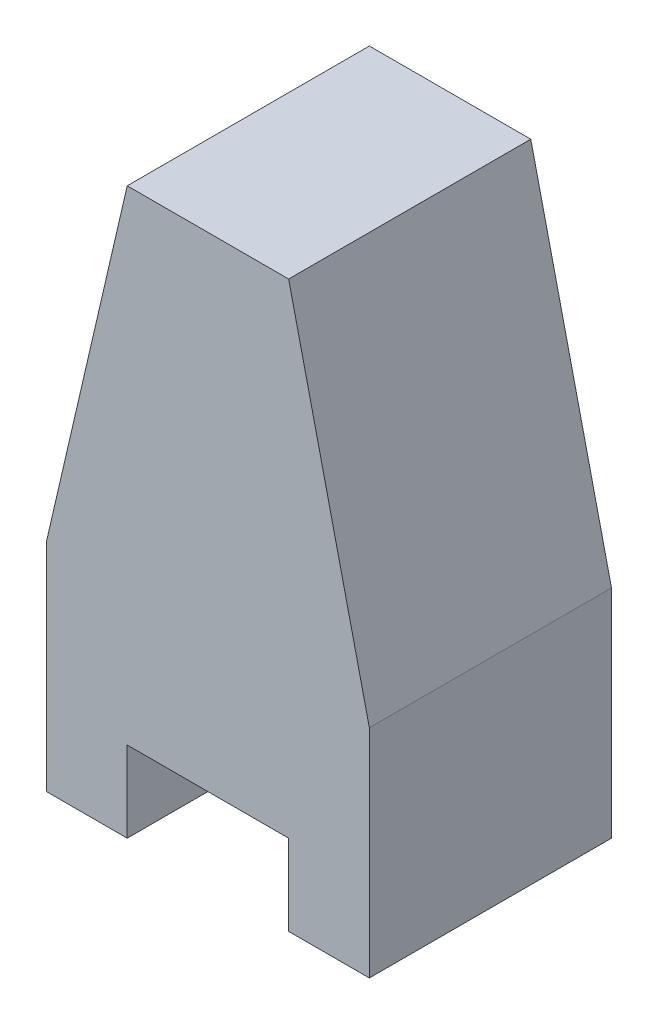
ISO-10303-21;
HEADER;
FILE_DESCRIPTION(('STEP AP214'),'2;1');
FILE_NAME('part.step','',(''),(''),'','','');
FILE_SCHEMA(('AUTOMOTIVE_DESIGN { 1 0 10303 214 1 1 1 1 }'));
ENDSEC;
DATA;
#1=APPLICATION_CONTEXT('core data for automotive mechanical design processes');
#2=APPLICATION_PROTOCOL_DEFINITION('international standard','automotive_design',2000,#1);
#3=PRODUCT_CONTEXT('',#1,'mechanical');
#4=PRODUCT('Part','Part','',(#3));
#5=PRODUCT_RELATED_PRODUCT_CATEGORY('part','',(#4));
#6=PRODUCT_DEFINITION_FORMATION('','',#4);
#7=PRODUCT_DEFINITION_CONTEXT('part definition',#1,'design');
#8=PRODUCT_DEFINITION('design','',#6,#7);
#9=PRODUCT_DEFINITION_SHAPE('','',#8);
#10=(LENGTH_UNIT() NAMED_UNIT(*) SI_UNIT(.MILLI.,.METRE.));
#11=(NAMED_UNIT(*) PLANE_ANGLE_UNIT() SI_UNIT($,.RADIAN.));
#12=(NAMED_UNIT(*) SI_UNIT($,.STERADIAN.) SOLID_ANGLE_UNIT());
#13=UNCERTAINTY_MEASURE_WITH_UNIT(LENGTH_MEASURE(1.E-05),#10,'distance_accuracy_value','');
#14=(GEOMETRIC_REPRESENTATION_CONTEXT(3) GLOBAL_UNCERTAINTY_ASSIGNED_CONTEXT((#13)) GLOBAL_UNIT_ASSIGNED_CONTEXT((#10,
#11,#12)) REPRESENTATION_CONTEXT('',''));
#15=CARTESIAN_POINT('',(0.,0.,0.));
#16=DIRECTION('',(0.,0.,1.));
#17=DIRECTION('',(1.,0.,0.));
#18=AXIS2_PLACEMENT_3D('',#15,#16,#17);
#19=CARTESIAN_POINT('',(-20.,-22.5,15.));
#20=DIRECTION('',(1.,0.,0.));
#21=DIRECTION('',(0.,0.,-1.));
#22=AXIS2_PLACEMENT_3D('',#19,#20,#21);
#23=PLANE('',#22);
#24=DIRECTION('',(0.,-1.,0.));
#25=VECTOR('',#24,1.);
#26=CARTESIAN_POINT('',(-20.,-22.5,0.));
#27=LINE('',#26,#25);
#28=CARTESIAN_POINT('',(-20.,-9.07342657342657,0.));
#29=VERTEX_POINT('',#28);
#30=CARTESIAN_POINT('',(-20.,-22.5,0.));
#31=VERTEX_POINT('',#30);
#32=EDGE_CURVE('E149',#29,#31,#27,.T.);
#33=ORIENTED_EDGE('',*,*,#32,.T.);
#34=DIRECTION('',(0.,0.,-1.));
#35=VECTOR('',#34,1.);
#36=CARTESIAN_POINT('',(-20.,-22.5,15.));
#37=LINE('',#36,#35);
#38=CARTESIAN_POINT('',(-20.,-22.5,15.));
#39=VERTEX_POINT('',#38);
#40=EDGE_CURVE('E11',#39,#31,#37,.T.);
#41=ORIENTED_EDGE('',*,*,#40,.F.);
#42=DIRECTION('',(0.,-1.,0.));
#43=VECTOR('',#42,1.);
#44=CARTESIAN_POINT('',(-20.,-22.5,15.));
#45=LINE('',#44,#43);
#46=CARTESIAN_POINT('',(-20.,-9.07342657342657,15.));
#47=VERTEX_POINT('',#46);
#48=EDGE_CURVE('E167',#47,#39,#45,.T.);
#49=ORIENTED_EDGE('',*,*,#48,.F.);
#50=DIRECTION('',(0.,0.,-1.));
#51=VECTOR('',#50,1.);
#52=CARTESIAN_POINT('',(-20.,-9.07342657342657,15.));
#53=LINE('',#52,#51);
#54=EDGE_CURVE('E145',#47,#29,#53,.T.);
#55=ORIENTED_EDGE('',*,*,#54,.T.);
#56=EDGE_LOOP('',(#33,#41,#49,#55));
#57=FACE_BOUND('',#56,.T.);
#58=ADVANCED_FACE('F41',(#57),#23,.F.);
#59=CARTESIAN_POINT('',(-20.,-22.5,15.));
#60=DIRECTION('',(0.,1.,0.));
#61=DIRECTION('',(0.,0.,1.));
#62=AXIS2_PLACEMENT_3D('',#59,#60,#61);
#63=PLANE('',#62);
#64=DIRECTION('',(1.,0.,0.));
#65=VECTOR('',#64,1.);
#66=CARTESIAN_POINT('',(-20.,-22.5,0.));
#67=LINE('',#66,#65);
#68=CARTESIAN_POINT('',(-15.,-22.5,0.));
#69=VERTEX_POINT('',#68);
#70=EDGE_CURVE('E152',#31,#69,#67,.T.);
#71=ORIENTED_EDGE('',*,*,#70,.T.);
#72=DIRECTION('',(0.,0.,-1.));
#73=VECTOR('',#72,1.);
#74=CARTESIAN_POINT('',(-15.,-22.5,15.));
#75=LINE('',#74,#73);
#76=CARTESIAN_POINT('',(-15.,-22.5,15.));
#77=VERTEX_POINT('',#76);
#78=EDGE_CURVE('E49',#77,#69,#75,.T.);
#79=ORIENTED_EDGE('',*,*,#78,.F.);
#80=DIRECTION('',(1.,0.,0.));
#81=VECTOR('',#80,1.);
#82=CARTESIAN_POINT('',(-20.,-22.5,15.));
#83=LINE('',#82,#81);
#84=EDGE_CURVE('E106',#39,#77,#83,.T.);
#85=ORIENTED_EDGE('',*,*,#84,.F.);
#86=ORIENTED_EDGE('',*,*,#40,.T.);
#87=EDGE_LOOP('',(#71,#79,#85,#86));
#88=FACE_BOUND('',#87,.T.);
#89=ADVANCED_FACE('F216',(#88),#63,.F.);
#90=CARTESIAN_POINT('',(-15.,-22.5,15.));
#91=DIRECTION('',(-1.,0.,0.));
#92=DIRECTION('',(0.,0.,1.));
#93=AXIS2_PLACEMENT_3D('',#90,#91,#92);
#94=PLANE('',#93);
#95=DIRECTION('',(0.,1.,0.));
#96=VECTOR('',#95,1.);
#97=CARTESIAN_POINT('',(-15.,-22.5,0.));
#98=LINE('',#97,#96);
#99=CARTESIAN_POINT('',(-15.,-17.5,0.));
#100=VERTEX_POINT('',#99);
#101=EDGE_CURVE('E154',#69,#100,#98,.T.);
#102=ORIENTED_EDGE('',*,*,#101,.T.);
#103=DIRECTION('',(0.,0.,-1.));
#104=VECTOR('',#103,1.);
#105=CARTESIAN_POINT('',(-15.,-17.5,15.));
#106=LINE('',#105,#104);
#107=CARTESIAN_POINT('',(-15.,-17.5,15.));
#108=VERTEX_POINT('',#107);
#109=EDGE_CURVE('E180',#108,#100,#106,.T.);
#110=ORIENTED_EDGE('',*,*,#109,.F.);
#111=DIRECTION('',(0.,1.,0.));
#112=VECTOR('',#111,1.);
#113=CARTESIAN_POINT('',(-15.,-22.5,15.));
#114=LINE('',#113,#112);
#115=EDGE_CURVE('E188',#77,#108,#114,.T.);
#116=ORIENTED_EDGE('',*,*,#115,.F.);
#117=ORIENTED_EDGE('',*,*,#78,.T.);
#118=EDGE_LOOP('',(#102,#110,#116,#117));
#119=FACE_BOUND('',#118,.T.);
#120=ADVANCED_FACE('F186',(#119),#94,.F.);
#121=CARTESIAN_POINT('',(-15.,-17.5,15.));
#122=DIRECTION('',(0.,1.,0.));
#123=DIRECTION('',(0.,0.,1.));
#124=AXIS2_PLACEMENT_3D('',#121,#122,#123);
#125=PLANE('',#124);
#126=DIRECTION('',(1.,0.,0.));
#127=VECTOR('',#126,1.);
#128=CARTESIAN_POINT('',(-15.,-17.5,0.));
#129=LINE('',#128,#127);
#130=CARTESIAN_POINT('',(-5.,-17.5,0.));
#131=VERTEX_POINT('',#130);
#132=EDGE_CURVE('E156',#100,#131,#129,.T.);
#133=ORIENTED_EDGE('',*,*,#132,.T.);
#134=DIRECTION('',(0.,0.,-1.));
#135=VECTOR('',#134,1.);
#136=CARTESIAN_POINT('',(-5.,-17.5,15.));
#137=LINE('',#136,#135);
#138=CARTESIAN_POINT('',(-5.,-17.5,15.));
#139=VERTEX_POINT('',#138);
#140=EDGE_CURVE('E177',#139,#131,#137,.T.);
#141=ORIENTED_EDGE('',*,*,#140,.F.);
#142=DIRECTION('',(1.,0.,0.));
#143=VECTOR('',#142,1.);
#144=CARTESIAN_POINT('',(-15.,-17.5,15.));
#145=LINE('',#144,#143);
#146=EDGE_CURVE('E206',#108,#139,#145,.T.);
#147=ORIENTED_EDGE('',*,*,#146,.F.);
#148=ORIENTED_EDGE('',*,*,#109,.T.);
#149=EDGE_LOOP('',(#133,#141,#147,#148));
#150=FACE_BOUND('',#149,.T.);
#151=ADVANCED_FACE('F197',(#150),#125,.F.);
#152=CARTESIAN_POINT('',(-5.,-22.5,15.));
#153=DIRECTION('',(1.,0.,0.));
#154=DIRECTION('',(0.,0.,-1.));
#155=AXIS2_PLACEMENT_3D('',#152,#153,#154);
#156=PLANE('',#155);
#157=DIRECTION('',(0.,-1.,0.));
#158=VECTOR('',#157,1.);
#159=CARTESIAN_POINT('',(-5.,-22.5,0.));
#160=LINE('',#159,#158);
#161=CARTESIAN_POINT('',(-5.,-22.5,0.));
#162=VERTEX_POINT('',#161);
#163=EDGE_CURVE('E158',#131,#162,#160,.T.);
#164=ORIENTED_EDGE('',*,*,#163,.T.);
#165=DIRECTION('',(0.,0.,-1.));
#166=VECTOR('',#165,1.);
#167=CARTESIAN_POINT('',(-5.,-22.5,15.));
#168=LINE('',#167,#166);
#169=CARTESIAN_POINT('',(-5.,-22.5,15.));
#170=VERTEX_POINT('',#169);
#171=EDGE_CURVE('E174',#170,#162,#168,.T.);
#172=ORIENTED_EDGE('',*,*,#171,.F.);
#173=DIRECTION('',(0.,-1.,0.));
#174=VECTOR('',#173,1.);
#175=CARTESIAN_POINT('',(-5.,-22.5,15.));
#176=LINE('',#175,#174);
#177=EDGE_CURVE('E203',#139,#170,#176,.T.);
#178=ORIENTED_EDGE('',*,*,#177,.F.);
#179=ORIENTED_EDGE('',*,*,#140,.T.);
#180=EDGE_LOOP('',(#164,#172,#178,#179));
#181=FACE_BOUND('',#180,.T.);
#182=ADVANCED_FACE('F201',(#181),#156,.F.);
#183=CARTESIAN_POINT('',(-5.,-22.5,15.));
#184=DIRECTION('',(0.,1.,0.));
#185=DIRECTION('',(0.,0.,1.));
#186=AXIS2_PLACEMENT_3D('',#183,#184,#185);
#187=PLANE('',#186);
#188=DIRECTION('',(1.,0.,0.));
#189=VECTOR('',#188,1.);
#190=CARTESIAN_POINT('',(-5.,-22.5,0.));
#191=LINE('',#190,#189);
#192=CARTESIAN_POINT('',(0.,-22.5,0.));
#193=VERTEX_POINT('',#192);
#194=EDGE_CURVE('E160',#162,#193,#191,.T.);
#195=ORIENTED_EDGE('',*,*,#194,.T.);
#196=DIRECTION('',(0.,0.,-1.));
#197=VECTOR('',#196,1.);
#198=CARTESIAN_POINT('',(0.,-22.5,15.));
#199=LINE('',#198,#197);
#200=CARTESIAN_POINT('',(0.,-22.5,15.));
#201=VERTEX_POINT('',#200);
#202=EDGE_CURVE('E171',#201,#193,#199,.T.);
#203=ORIENTED_EDGE('',*,*,#202,.F.);
#204=DIRECTION('',(1.,0.,0.));
#205=VECTOR('',#204,1.);
#206=CARTESIAN_POINT('',(-5.,-22.5,15.));
#207=LINE('',#206,#205);
#208=EDGE_CURVE('E205',#170,#201,#207,.T.);
#209=ORIENTED_EDGE('',*,*,#208,.F.);
#210=ORIENTED_EDGE('',*,*,#171,.T.);
#211=EDGE_LOOP('',(#195,#203,#209,#210));
#212=FACE_BOUND('',#211,.T.);
#213=ADVANCED_FACE('F228',(#212),#187,.F.);
#214=CARTESIAN_POINT('',(0.,-22.5,15.));
#215=DIRECTION('',(-1.,0.,0.));
#216=DIRECTION('',(0.,0.,1.));
#217=AXIS2_PLACEMENT_3D('',#214,#215,#216);
#218=PLANE('',#217);
#219=DIRECTION('',(0.,1.,0.));
#220=VECTOR('',#219,1.);
#221=CARTESIAN_POINT('',(0.,-22.5,0.));
#222=LINE('',#221,#220);
#223=CARTESIAN_POINT('',(0.,-9.07342657342657,0.));
#224=VERTEX_POINT('',#223);
#225=EDGE_CURVE('E162',#193,#224,#222,.T.);
#226=ORIENTED_EDGE('',*,*,#225,.T.);
#227=DIRECTION('',(0.,0.,-1.));
#228=VECTOR('',#227,1.);
#229=CARTESIAN_POINT('',(0.,-9.07342657342657,15.));
#230=LINE('',#229,#228);
#231=CARTESIAN_POINT('',(0.,-9.07342657342657,15.));
#232=VERTEX_POINT('',#231);
#233=EDGE_CURVE('E140',#232,#224,#230,.T.);
#234=ORIENTED_EDGE('',*,*,#233,.F.);
#235=DIRECTION('',(0.,1.,0.));
#236=VECTOR('',#235,1.);
#237=CARTESIAN_POINT('',(0.,-22.5,15.));
#238=LINE('',#237,#236);
#239=EDGE_CURVE('E131',#201,#232,#238,.T.);
#240=ORIENTED_EDGE('',*,*,#239,.F.);
#241=ORIENTED_EDGE('',*,*,#202,.T.);
#242=EDGE_LOOP('',(#226,#234,#240,#241));
#243=FACE_BOUND('',#242,.T.);
#244=ADVANCED_FACE('F231',(#243),#218,.F.);
#245=CARTESIAN_POINT('',(0.,-9.07342657342657,15.));
#246=DIRECTION('',(-0.974177874363604,-0.225781906051857,0.));
#247=DIRECTION('',(0.225781906051857,-0.974177874363605,0.));
#248=AXIS2_PLACEMENT_3D('',#245,#246,#247);
#249=PLANE('',#248);
#250=DIRECTION('',(-0.225781906051857,0.974177874363604,0.));
#251=VECTOR('',#250,1.);
#252=CARTESIAN_POINT('',(0.,-9.07342657342657,0.));
#253=LINE('',#252,#251);
#254=CARTESIAN_POINT('',(-5.,12.5,0.));
#255=VERTEX_POINT('',#254);
#256=EDGE_CURVE('E139',#224,#255,#253,.T.);
#257=ORIENTED_EDGE('',*,*,#256,.T.);
#258=DIRECTION('',(0.,0.,-1.));
#259=VECTOR('',#258,1.);
#260=CARTESIAN_POINT('',(-5.,12.5,15.));
#261=LINE('',#260,#259);
#262=CARTESIAN_POINT('',(-5.,12.5,15.));
#263=VERTEX_POINT('',#262);
#264=EDGE_CURVE('E136',#263,#255,#261,.T.);
#265=ORIENTED_EDGE('',*,*,#264,.F.);
#266=DIRECTION('',(-0.225781906051857,0.974177874363604,0.));
#267=VECTOR('',#266,1.);
#268=CARTESIAN_POINT('',(0.,-9.07342657342657,15.));
#269=LINE('',#268,#267);
#270=EDGE_CURVE('E125',#232,#263,#269,.T.);
#271=ORIENTED_EDGE('',*,*,#270,.F.);
#272=ORIENTED_EDGE('',*,*,#233,.T.);
#273=EDGE_LOOP('',(#257,#265,#271,#272));
#274=FACE_BOUND('',#273,.T.);
#275=ADVANCED_FACE('F137',(#274),#249,.F.);
#276=CARTESIAN_POINT('',(-15.,12.5,15.));
#277=DIRECTION('',(0.,-1.,0.));
#278=DIRECTION('',(1.,0.,0.));
#279=AXIS2_PLACEMENT_3D('',#276,#277,#278);
#280=PLANE('',#279);
#281=DIRECTION('',(-1.,0.,0.));
#282=VECTOR('',#281,1.);
#283=CARTESIAN_POINT('',(-15.,12.5,0.));
#284=LINE('',#283,#282);
#285=CARTESIAN_POINT('',(-15.,12.5,0.));
#286=VERTEX_POINT('',#285);
#287=EDGE_CURVE('E92',#255,#286,#284,.T.);
#288=ORIENTED_EDGE('',*,*,#287,.T.);
#289=DIRECTION('',(0.,0.,-1.));
#290=VECTOR('',#289,1.);
#291=CARTESIAN_POINT('',(-15.,12.5,15.));
#292=LINE('',#291,#290);
#293=CARTESIAN_POINT('',(-15.,12.5,15.));
#294=VERTEX_POINT('',#293);
#295=EDGE_CURVE('E141',#294,#286,#292,.T.);
#296=ORIENTED_EDGE('',*,*,#295,.F.);
#297=DIRECTION('',(-1.,0.,0.));
#298=VECTOR('',#297,1.);
#299=CARTESIAN_POINT('',(-15.,12.5,15.));
#300=LINE('',#299,#298);
#301=EDGE_CURVE('E129',#263,#294,#300,.T.);
#302=ORIENTED_EDGE('',*,*,#301,.F.);
#303=ORIENTED_EDGE('',*,*,#264,.T.);
#304=EDGE_LOOP('',(#288,#296,#302,#303));
#305=FACE_BOUND('',#304,.T.);
#306=ADVANCED_FACE('F143',(#305),#280,.F.);
#307=CARTESIAN_POINT('',(-20.,-9.07342657342657,15.));
#308=DIRECTION('',(0.974177874363604,-0.225781906051856,0.));
#309=DIRECTION('',(0.225781906051856,0.974177874363604,0.));
#310=AXIS2_PLACEMENT_3D('',#307,#308,#309);
#311=PLANE('',#310);
#312=DIRECTION('',(-0.225781906051856,-0.974177874363604,0.));
#313=VECTOR('',#312,1.);
#314=CARTESIAN_POINT('',(-20.,-9.07342657342657,0.));
#315=LINE('',#314,#313);
#316=EDGE_CURVE('E98',#286,#29,#315,.T.);
#317=ORIENTED_EDGE('',*,*,#316,.T.);
#318=ORIENTED_EDGE('',*,*,#54,.F.);
#319=DIRECTION('',(-0.225781906051856,-0.974177874363604,0.));
#320=VECTOR('',#319,1.);
#321=CARTESIAN_POINT('',(-20.,-9.07342657342657,15.));
#322=LINE('',#321,#320);
#323=EDGE_CURVE('E57',#294,#47,#322,.T.);
#324=ORIENTED_EDGE('',*,*,#323,.F.);
#325=ORIENTED_EDGE('',*,*,#295,.T.);
#326=EDGE_LOOP('',(#317,#318,#324,#325));
#327=FACE_BOUND('',#326,.T.);
#328=ADVANCED_FACE('F240',(#327),#311,.F.);
#329=CARTESIAN_POINT('',(0.,0.,15.));
#330=DIRECTION('',(0.,0.,-1.));
#331=DIRECTION('',(-1.,0.,0.));
#332=AXIS2_PLACEMENT_3D('',#329,#330,#331);
#333=PLANE('',#332);
#334=ORIENTED_EDGE('',*,*,#48,.T.);
#335=ORIENTED_EDGE('',*,*,#84,.T.);
#336=ORIENTED_EDGE('',*,*,#115,.T.);
#337=ORIENTED_EDGE('',*,*,#146,.T.);
#338=ORIENTED_EDGE('',*,*,#177,.T.);
#339=ORIENTED_EDGE('',*,*,#208,.T.);
#340=ORIENTED_EDGE('',*,*,#239,.T.);
#341=ORIENTED_EDGE('',*,*,#270,.T.);
#342=ORIENTED_EDGE('',*,*,#301,.T.);
#343=ORIENTED_EDGE('',*,*,#323,.T.);
#344=EDGE_LOOP('',(#334,#335,#336,#337,#338,#339,#340,#341,#342,#343));
#345=FACE_BOUND('',#344,.T.);
#346=ADVANCED_FACE('F127',(#345),#333,.F.);
#347=CARTESIAN_POINT('',(0.,0.,0.));
#348=DIRECTION('',(0.,0.,-1.));
#349=DIRECTION('',(-1.,0.,0.));
#350=AXIS2_PLACEMENT_3D('',#347,#348,#349);
#351=PLANE('',#350);
#352=ORIENTED_EDGE('',*,*,#32,.F.);
#353=ORIENTED_EDGE('',*,*,#316,.F.);
#354=ORIENTED_EDGE('',*,*,#287,.F.);
#355=ORIENTED_EDGE('',*,*,#256,.F.);
#356=ORIENTED_EDGE('',*,*,#225,.F.);
#357=ORIENTED_EDGE('',*,*,#194,.F.);
#358=ORIENTED_EDGE('',*,*,#163,.F.);
#359=ORIENTED_EDGE('',*,*,#132,.F.);
#360=ORIENTED_EDGE('',*,*,#101,.F.);
#361=ORIENTED_EDGE('',*,*,#70,.F.);
#362=EDGE_LOOP('',(#352,#353,#354,#355,#356,#357,#358,#359,#360,#361));
#363=FACE_BOUND('',#362,.T.);
#364=ADVANCED_FACE('F192',(#363),#351,.T.);
#365=CLOSED_SHELL('',(#58,#89,#120,#151,#182,#213,#244,#275,#306,#328,#346,#364));
#366=MANIFOLD_SOLID_BREP('B2',#365);
#367=ADVANCED_BREP_SHAPE_REPRESENTATION('',(#18,#366),#14);
#368=SHAPE_DEFINITION_REPRESENTATION(#9,#367);
ENDSEC;
END-ISO-10303-21;
